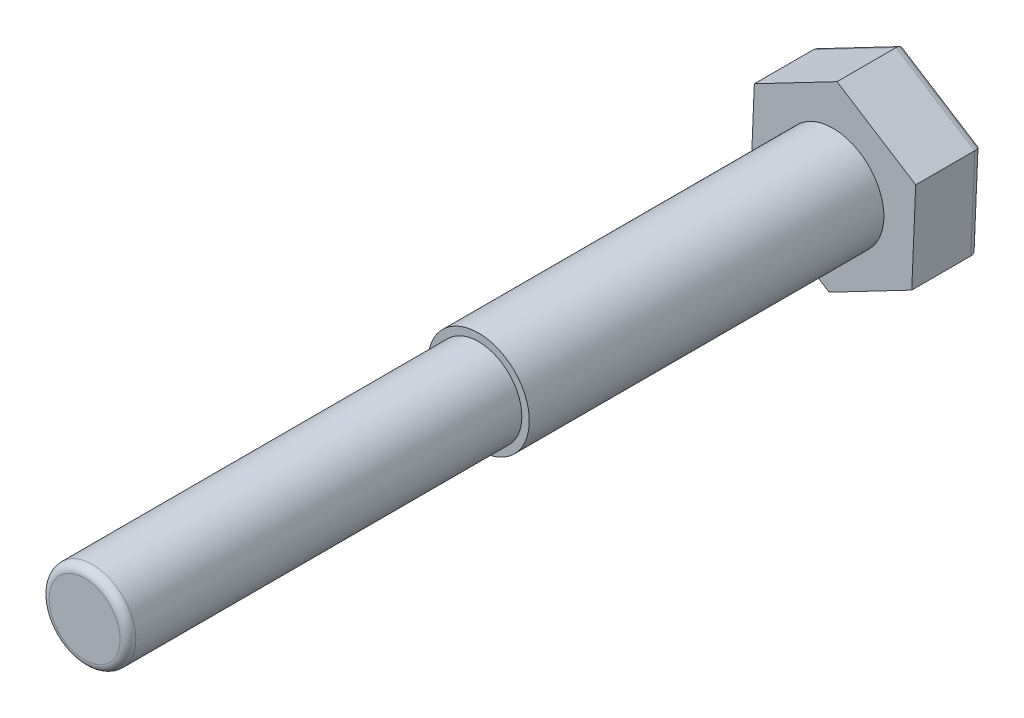
ISO-10303-21;
HEADER;
FILE_DESCRIPTION(('STEP AP214'),'2;1');
FILE_NAME('part.step','',(''),(''),'','','');
FILE_SCHEMA(('AUTOMOTIVE_DESIGN { 1 0 10303 214 1 1 1 1 }'));
ENDSEC;
DATA;
#1=APPLICATION_CONTEXT('core data for automotive mechanical design processes');
#2=APPLICATION_PROTOCOL_DEFINITION('international standard','automotive_design',2000,#1);
#3=PRODUCT_CONTEXT('',#1,'mechanical');
#4=PRODUCT('Part','Part','',(#3));
#5=PRODUCT_RELATED_PRODUCT_CATEGORY('part','',(#4));
#6=PRODUCT_DEFINITION_FORMATION('','',#4);
#7=PRODUCT_DEFINITION_CONTEXT('part definition',#1,'design');
#8=PRODUCT_DEFINITION('design','',#6,#7);
#9=PRODUCT_DEFINITION_SHAPE('','',#8);
#10=(LENGTH_UNIT() NAMED_UNIT(*) SI_UNIT(.MILLI.,.METRE.));
#11=(NAMED_UNIT(*) PLANE_ANGLE_UNIT() SI_UNIT($,.RADIAN.));
#12=(NAMED_UNIT(*) SI_UNIT($,.STERADIAN.) SOLID_ANGLE_UNIT());
#13=UNCERTAINTY_MEASURE_WITH_UNIT(LENGTH_MEASURE(1.E-05),#10,'distance_accuracy_value','');
#14=(GEOMETRIC_REPRESENTATION_CONTEXT(3) GLOBAL_UNCERTAINTY_ASSIGNED_CONTEXT((#13)) GLOBAL_UNIT_ASSIGNED_CONTEXT((#10,
#11,#12)) REPRESENTATION_CONTEXT('',''));
#15=CARTESIAN_POINT('',(0.,0.,0.));
#16=DIRECTION('',(0.,0.,1.));
#17=DIRECTION('',(1.,0.,0.));
#18=AXIS2_PLACEMENT_3D('',#15,#16,#17);
#19=CARTESIAN_POINT('',(0.,0.,107.));
#20=DIRECTION('',(0.,0.,1.));
#21=DIRECTION('',(1.,0.,0.));
#22=AXIS2_PLACEMENT_3D('',#19,#20,#21);
#23=PLANE('',#22);
#24=CARTESIAN_POINT('',(0.,0.,107.));
#25=DIRECTION('',(0.,0.,1.));
#26=DIRECTION('',(1.,0.,0.));
#27=AXIS2_PLACEMENT_3D('',#24,#25,#26);
#28=CIRCLE('',#27,12.9);
#29=CARTESIAN_POINT('',(-12.9,0.,107.));
#30=VERTEX_POINT('',#29);
#31=EDGE_CURVE('E130',#30,#30,#28,.T.);
#32=ORIENTED_EDGE('',*,*,#31,.T.);
#33=EDGE_LOOP('',(#32));
#34=FACE_BOUND('',#33,.T.);
#35=CARTESIAN_POINT('',(0.,0.,107.));
#36=DIRECTION('',(0.,0.,1.));
#37=DIRECTION('',(1.,0.,0.));
#38=AXIS2_PLACEMENT_3D('',#35,#36,#37);
#39=CIRCLE('',#38,11.);
#40=CARTESIAN_POINT('',(11.,0.,107.));
#41=VERTEX_POINT('',#40);
#42=EDGE_CURVE('E168',#41,#41,#39,.T.);
#43=ORIENTED_EDGE('',*,*,#42,.F.);
#44=EDGE_LOOP('',(#43));
#45=FACE_BOUND('',#44,.T.);
#46=ADVANCED_FACE('F36',(#34,#45),#23,.T.);
#47=CARTESIAN_POINT('',(18.9733976863162,-36.3457037383633,17.));
#48=DIRECTION('',(0.,0.,-1.));
#49=DIRECTION('',(-1.,0.,0.));
#50=AXIS2_PLACEMENT_3D('',#47,#48,#49);
#51=PLANE('',#50);
#52=DIRECTION('',(0.0424733530909036,0.999097599975706,0.));
#53=VECTOR('',#52,1.);
#54=CARTESIAN_POINT('',(19.9787997617734,-12.6957037383635,17.));
#55=LINE('',#54,#53);
#56=CARTESIAN_POINT('',(19.9787997617734,-12.6957037383635,17.));
#57=VERTEX_POINT('',#56);
#58=CARTESIAN_POINT('',(20.9842018372306,10.9542962616365,17.));
#59=VERTEX_POINT('',#58);
#60=EDGE_CURVE('E122',#57,#59,#55,.T.);
#61=ORIENTED_EDGE('',*,*,#60,.T.);
#62=DIRECTION('',(-0.844007225893572,0.536331802748482,0.));
#63=VECTOR('',#62,1.);
#64=CARTESIAN_POINT('',(20.9842018372306,10.9542962616365,17.));
#65=LINE('',#64,#63);
#66=CARTESIAN_POINT('',(1.0054020754572,23.65,17.));
#67=VERTEX_POINT('',#66);
#68=EDGE_CURVE('E110',#59,#67,#65,.T.);
#69=ORIENTED_EDGE('',*,*,#68,.T.);
#70=DIRECTION('',(-0.886480578984472,-0.462765797227231,0.));
#71=VECTOR('',#70,1.);
#72=CARTESIAN_POINT('',(1.0054020754572,23.65,17.));
#73=LINE('',#72,#71);
#74=CARTESIAN_POINT('',(-19.9787997617736,12.6957037383632,17.));
#75=VERTEX_POINT('',#74);
#76=EDGE_CURVE('E121',#67,#75,#73,.T.);
#77=ORIENTED_EDGE('',*,*,#76,.T.);
#78=DIRECTION('',(-0.0424733530908878,-0.999097599975706,0.));
#79=VECTOR('',#78,1.);
#80=CARTESIAN_POINT('',(-19.9787997617736,12.6957037383632,17.));
#81=LINE('',#80,#79);
#82=CARTESIAN_POINT('',(-20.9842018372304,-10.9542962616368,17.));
#83=VERTEX_POINT('',#82);
#84=EDGE_CURVE('E272',#75,#83,#81,.T.);
#85=ORIENTED_EDGE('',*,*,#84,.T.);
#86=DIRECTION('',(0.844007225893576,-0.536331802748476,0.));
#87=VECTOR('',#86,1.);
#88=CARTESIAN_POINT('',(-20.9842018372304,-10.9542962616368,17.));
#89=LINE('',#88,#87);
#90=CARTESIAN_POINT('',(-1.00540207545719,-23.65,17.));
#91=VERTEX_POINT('',#90);
#92=EDGE_CURVE('E274',#83,#91,#89,.T.);
#93=ORIENTED_EDGE('',*,*,#92,.T.);
#94=DIRECTION('',(0.886480578984476,0.462765797227224,0.));
#95=VECTOR('',#94,1.);
#96=CARTESIAN_POINT('',(-1.00540207545719,-23.65,17.));
#97=LINE('',#96,#95);
#98=EDGE_CURVE('E128',#91,#57,#97,.T.);
#99=ORIENTED_EDGE('',*,*,#98,.T.);
#100=EDGE_LOOP('',(#61,#69,#77,#85,#93,#99));
#101=FACE_BOUND('',#100,.T.);
#102=CARTESIAN_POINT('',(0.,0.,17.));
#103=DIRECTION('',(0.,0.,-1.));
#104=DIRECTION('',(-1.,0.,0.));
#105=AXIS2_PLACEMENT_3D('',#102,#103,#104);
#106=CIRCLE('',#105,12.9);
#107=CARTESIAN_POINT('',(-12.9,0.,17.));
#108=VERTEX_POINT('',#107);
#109=EDGE_CURVE('E135',#108,#108,#106,.F.);
#110=ORIENTED_EDGE('',*,*,#109,.F.);
#111=EDGE_LOOP('',(#110));
#112=FACE_BOUND('',#111,.T.);
#113=ADVANCED_FACE('F125',(#101,#112),#51,.F.);
#114=CARTESIAN_POINT('',(19.9787997617734,-12.6957037383635,17.));
#115=DIRECTION('',(-0.999097599975706,0.0424733530909036,0.));
#116=DIRECTION('',(-0.0424733530909036,-0.999097599975706,0.));
#117=AXIS2_PLACEMENT_3D('',#114,#115,#116);
#118=PLANE('',#117);
#119=DIRECTION('',(0.,0.,-1.));
#120=VECTOR('',#119,1.);
#121=CARTESIAN_POINT('',(19.9787997617734,-12.6957037383635,17.));
#122=LINE('',#121,#120);
#123=CARTESIAN_POINT('',(19.9787997617734,-12.6957037383635,2.));
#124=VERTEX_POINT('',#123);
#125=EDGE_CURVE('E279',#57,#124,#122,.T.);
#126=ORIENTED_EDGE('',*,*,#125,.T.);
#127=DIRECTION('',(0.0424733530909036,0.999097599975706,0.));
#128=VECTOR('',#127,1.);
#129=CARTESIAN_POINT('',(20.9842018372306,10.9542962616365,2.));
#130=LINE('',#129,#128);
#131=CARTESIAN_POINT('',(20.9842018372306,10.9542962616365,2.));
#132=VERTEX_POINT('',#131);
#133=EDGE_CURVE('E134',#124,#132,#130,.T.);
#134=ORIENTED_EDGE('',*,*,#133,.T.);
#135=DIRECTION('',(0.,0.,-1.));
#136=VECTOR('',#135,1.);
#137=CARTESIAN_POINT('',(20.9842018372306,10.9542962616365,17.));
#138=LINE('',#137,#136);
#139=EDGE_CURVE('E115',#59,#132,#138,.T.);
#140=ORIENTED_EDGE('',*,*,#139,.F.);
#141=ORIENTED_EDGE('',*,*,#60,.F.);
#142=EDGE_LOOP('',(#126,#134,#140,#141));
#143=FACE_BOUND('',#142,.T.);
#144=ADVANCED_FACE('F132',(#143),#118,.F.);
#145=CARTESIAN_POINT('',(20.9842018372306,10.9542962616365,17.));
#146=DIRECTION('',(-0.536331802748482,-0.844007225893572,0.));
#147=DIRECTION('',(0.844007225893572,-0.536331802748482,0.));
#148=AXIS2_PLACEMENT_3D('',#145,#146,#147);
#149=PLANE('',#148);
#150=ORIENTED_EDGE('',*,*,#139,.T.);
#151=DIRECTION('',(-0.844007225893572,0.536331802748482,0.));
#152=VECTOR('',#151,1.);
#153=CARTESIAN_POINT('',(1.00540207545719,23.65,2.));
#154=LINE('',#153,#152);
#155=CARTESIAN_POINT('',(1.0054020754572,23.65,2.));
#156=VERTEX_POINT('',#155);
#157=EDGE_CURVE('E138',#132,#156,#154,.T.);
#158=ORIENTED_EDGE('',*,*,#157,.T.);
#159=DIRECTION('',(0.,0.,-1.));
#160=VECTOR('',#159,1.);
#161=CARTESIAN_POINT('',(1.0054020754572,23.65,17.));
#162=LINE('',#161,#160);
#163=EDGE_CURVE('E118',#67,#156,#162,.T.);
#164=ORIENTED_EDGE('',*,*,#163,.F.);
#165=ORIENTED_EDGE('',*,*,#68,.F.);
#166=EDGE_LOOP('',(#150,#158,#164,#165));
#167=FACE_BOUND('',#166,.T.);
#168=ADVANCED_FACE('F112',(#167),#149,.F.);
#169=CARTESIAN_POINT('',(1.0054020754572,23.65,17.));
#170=DIRECTION('',(0.462765797227231,-0.886480578984472,0.));
#171=DIRECTION('',(0.886480578984472,0.462765797227231,0.));
#172=AXIS2_PLACEMENT_3D('',#169,#170,#171);
#173=PLANE('',#172);
#174=ORIENTED_EDGE('',*,*,#163,.T.);
#175=DIRECTION('',(-0.886480578984472,-0.462765797227231,0.));
#176=VECTOR('',#175,1.);
#177=CARTESIAN_POINT('',(-19.9787997617736,12.6957037383632,2.));
#178=LINE('',#177,#176);
#179=CARTESIAN_POINT('',(-19.9787997617736,12.6957037383632,2.));
#180=VERTEX_POINT('',#179);
#181=EDGE_CURVE('E158',#156,#180,#178,.T.);
#182=ORIENTED_EDGE('',*,*,#181,.T.);
#183=DIRECTION('',(0.,0.,-1.));
#184=VECTOR('',#183,1.);
#185=CARTESIAN_POINT('',(-19.9787997617736,12.6957037383632,17.));
#186=LINE('',#185,#184);
#187=EDGE_CURVE('E140',#75,#180,#186,.T.);
#188=ORIENTED_EDGE('',*,*,#187,.F.);
#189=ORIENTED_EDGE('',*,*,#76,.F.);
#190=EDGE_LOOP('',(#174,#182,#188,#189));
#191=FACE_BOUND('',#190,.T.);
#192=ADVANCED_FACE('F223',(#191),#173,.F.);
#193=CARTESIAN_POINT('',(-19.9787997617736,12.6957037383632,17.));
#194=DIRECTION('',(0.999097599975706,-0.0424733530908878,0.));
#195=DIRECTION('',(0.0424733530908878,0.999097599975707,0.));
#196=AXIS2_PLACEMENT_3D('',#193,#194,#195);
#197=PLANE('',#196);
#198=ORIENTED_EDGE('',*,*,#187,.T.);
#199=DIRECTION('',(-0.0424733530908878,-0.999097599975707,0.));
#200=VECTOR('',#199,1.);
#201=CARTESIAN_POINT('',(-20.9842018372304,-10.9542962616368,2.));
#202=LINE('',#201,#200);
#203=CARTESIAN_POINT('',(-20.9842018372304,-10.9542962616368,2.));
#204=VERTEX_POINT('',#203);
#205=EDGE_CURVE('E160',#180,#204,#202,.T.);
#206=ORIENTED_EDGE('',*,*,#205,.T.);
#207=DIRECTION('',(0.,0.,-1.));
#208=VECTOR('',#207,1.);
#209=CARTESIAN_POINT('',(-20.9842018372304,-10.9542962616368,17.));
#210=LINE('',#209,#208);
#211=EDGE_CURVE('E283',#83,#204,#210,.T.);
#212=ORIENTED_EDGE('',*,*,#211,.F.);
#213=ORIENTED_EDGE('',*,*,#84,.F.);
#214=EDGE_LOOP('',(#198,#206,#212,#213));
#215=FACE_BOUND('',#214,.T.);
#216=ADVANCED_FACE('F220',(#215),#197,.F.);
#217=CARTESIAN_POINT('',(-20.9842018372304,-10.9542962616368,17.));
#218=DIRECTION('',(0.536331802748476,0.844007225893576,0.));
#219=DIRECTION('',(-0.844007225893576,0.536331802748476,0.));
#220=AXIS2_PLACEMENT_3D('',#217,#218,#219);
#221=PLANE('',#220);
#222=ORIENTED_EDGE('',*,*,#211,.T.);
#223=DIRECTION('',(0.844007225893576,-0.536331802748476,0.));
#224=VECTOR('',#223,1.);
#225=CARTESIAN_POINT('',(-1.00540207545719,-23.65,2.));
#226=LINE('',#225,#224);
#227=CARTESIAN_POINT('',(-1.00540207545719,-23.65,2.));
#228=VERTEX_POINT('',#227);
#229=EDGE_CURVE('E59',#204,#228,#226,.T.);
#230=ORIENTED_EDGE('',*,*,#229,.T.);
#231=DIRECTION('',(0.,0.,-1.));
#232=VECTOR('',#231,1.);
#233=CARTESIAN_POINT('',(-1.00540207545719,-23.65,17.));
#234=LINE('',#233,#232);
#235=EDGE_CURVE('E281',#91,#228,#234,.T.);
#236=ORIENTED_EDGE('',*,*,#235,.F.);
#237=ORIENTED_EDGE('',*,*,#92,.F.);
#238=EDGE_LOOP('',(#222,#230,#236,#237));
#239=FACE_BOUND('',#238,.T.);
#240=ADVANCED_FACE('F217',(#239),#221,.F.);
#241=CARTESIAN_POINT('',(-1.00540207545719,-23.65,17.));
#242=DIRECTION('',(-0.462765797227224,0.886480578984476,0.));
#243=DIRECTION('',(-0.886480578984476,-0.462765797227224,0.));
#244=AXIS2_PLACEMENT_3D('',#241,#242,#243);
#245=PLANE('',#244);
#246=ORIENTED_EDGE('',*,*,#235,.T.);
#247=DIRECTION('',(0.886480578984476,0.462765797227224,0.));
#248=VECTOR('',#247,1.);
#249=CARTESIAN_POINT('',(19.9787997617734,-12.6957037383635,2.));
#250=LINE('',#249,#248);
#251=EDGE_CURVE('E51',#228,#124,#250,.T.);
#252=ORIENTED_EDGE('',*,*,#251,.T.);
#253=ORIENTED_EDGE('',*,*,#125,.F.);
#254=ORIENTED_EDGE('',*,*,#98,.F.);
#255=EDGE_LOOP('',(#246,#252,#253,#254));
#256=FACE_BOUND('',#255,.T.);
#257=ADVANCED_FACE('F213',(#256),#245,.F.);
#258=CARTESIAN_POINT('',(18.9733976863162,-36.3457037383633,0.));
#259=DIRECTION('',(0.,0.,-1.));
#260=DIRECTION('',(-1.,0.,0.));
#261=AXIS2_PLACEMENT_3D('',#258,#259,#260);
#262=PLANE('',#261);
#263=DIRECTION('',(-0.886480578984472,-0.462765797227231,0.));
#264=VECTOR('',#263,1.);
#265=CARTESIAN_POINT('',(1.93093366991166,21.8770388420311,0.));
#266=LINE('',#265,#264);
#267=CARTESIAN_POINT('',(-18.029648565503,11.4570984955961,0.));
#268=VERTEX_POINT('',#267);
#269=CARTESIAN_POINT('',(0.907314068095531,21.3426829268293,0.));
#270=VERTEX_POINT('',#269);
#271=EDGE_CURVE('E153',#268,#270,#266,.F.);
#272=ORIENTED_EDGE('',*,*,#271,.T.);
#273=DIRECTION('',(-0.844007225893572,0.536331802748482,0.));
#274=VECTOR('',#273,1.);
#275=CARTESIAN_POINT('',(19.9115382317336,9.26628180984933,0.));
#276=LINE('',#275,#274);
#277=CARTESIAN_POINT('',(18.9369626335983,9.88558443123292,0.));
#278=VERTEX_POINT('',#277);
#279=EDGE_CURVE('E155',#270,#278,#276,.F.);
#280=ORIENTED_EDGE('',*,*,#279,.T.);
#281=DIRECTION('',(0.0424733530909036,0.999097599975706,0.));
#282=VECTOR('',#281,1.);
#283=CARTESIAN_POINT('',(17.980604561822,-12.6107570321817,0.));
#284=LINE('',#283,#282);
#285=CARTESIAN_POINT('',(18.0296485655028,-11.4570984955964,0.));
#286=VERTEX_POINT('',#285);
#287=EDGE_CURVE('E145',#278,#286,#284,.F.);
#288=ORIENTED_EDGE('',*,*,#287,.T.);
#289=DIRECTION('',(0.886480578984476,0.462765797227224,0.));
#290=VECTOR('',#289,1.);
#291=CARTESIAN_POINT('',(-1.93093366991164,-21.877038842031,0.));
#292=LINE('',#291,#290);
#293=CARTESIAN_POINT('',(-0.90731406809552,-21.3426829268293,0.));
#294=VERTEX_POINT('',#293);
#295=EDGE_CURVE('E147',#286,#294,#292,.F.);
#296=ORIENTED_EDGE('',*,*,#295,.T.);
#297=DIRECTION('',(0.844007225893576,-0.536331802748476,0.));
#298=VECTOR('',#297,1.);
#299=CARTESIAN_POINT('',(-19.9115382317334,-9.26628180984964,0.));
#300=LINE('',#299,#298);
#301=CARTESIAN_POINT('',(-18.9369626335981,-9.88558443123322,0.));
#302=VERTEX_POINT('',#301);
#303=EDGE_CURVE('E149',#294,#302,#300,.F.);
#304=ORIENTED_EDGE('',*,*,#303,.T.);
#305=DIRECTION('',(-0.0424733530908878,-0.999097599975707,0.));
#306=VECTOR('',#305,1.);
#307=CARTESIAN_POINT('',(-17.9806045618221,12.6107570321814,0.));
#308=LINE('',#307,#306);
#309=EDGE_CURVE('E151',#302,#268,#308,.F.);
#310=ORIENTED_EDGE('',*,*,#309,.T.);
#311=EDGE_LOOP('',(#272,#280,#288,#296,#304,#310));
#312=FACE_BOUND('',#311,.T.);
#313=ADVANCED_FACE('F208',(#312),#262,.T.);
#314=CARTESIAN_POINT('',(0.,0.,107.));
#315=DIRECTION('',(0.,0.,-1.));
#316=DIRECTION('',(-1.,0.,0.));
#317=AXIS2_PLACEMENT_3D('',#314,#315,#316);
#318=CYLINDRICAL_SURFACE('',#317,12.9);
#319=CARTESIAN_POINT('',(-12.9,0.,107.));
#320=CARTESIAN_POINT('',(-12.9,0.,106.0625));
#321=CARTESIAN_POINT('',(-12.9,0.,105.125));
#322=CARTESIAN_POINT('',(-12.9,0.,103.25));
#323=CARTESIAN_POINT('',(-12.9,0.,102.3125));
#324=CARTESIAN_POINT('',(-12.9,0.,100.4375));
#325=CARTESIAN_POINT('',(-12.9,0.,99.5));
#326=CARTESIAN_POINT('',(-12.9,0.,97.625));
#327=CARTESIAN_POINT('',(-12.9,0.,96.6875));
#328=CARTESIAN_POINT('',(-12.9,0.,94.8125));
#329=CARTESIAN_POINT('',(-12.9,0.,93.875));
#330=CARTESIAN_POINT('',(-12.9,0.,92.));
#331=CARTESIAN_POINT('',(-12.9,0.,91.0625));
#332=CARTESIAN_POINT('',(-12.9,0.,89.1875));
#333=CARTESIAN_POINT('',(-12.9,0.,88.25));
#334=CARTESIAN_POINT('',(-12.9,0.,86.375));
#335=CARTESIAN_POINT('',(-12.9,0.,85.4375));
#336=CARTESIAN_POINT('',(-12.9,0.,83.5625));
#337=CARTESIAN_POINT('',(-12.9,0.,82.625));
#338=CARTESIAN_POINT('',(-12.9,0.,80.75));
#339=CARTESIAN_POINT('',(-12.9,0.,79.8125));
#340=CARTESIAN_POINT('',(-12.9,0.,77.9375));
#341=CARTESIAN_POINT('',(-12.9,0.,77.));
#342=CARTESIAN_POINT('',(-12.9,0.,75.125));
#343=CARTESIAN_POINT('',(-12.9,0.,74.1875));
#344=CARTESIAN_POINT('',(-12.9,0.,72.3125));
#345=CARTESIAN_POINT('',(-12.9,0.,71.375));
#346=CARTESIAN_POINT('',(-12.9,0.,69.5));
#347=CARTESIAN_POINT('',(-12.9,0.,68.5625));
#348=CARTESIAN_POINT('',(-12.9,0.,66.6875));
#349=CARTESIAN_POINT('',(-12.9,0.,65.75));
#350=CARTESIAN_POINT('',(-12.9,0.,63.875));
#351=CARTESIAN_POINT('',(-12.9,0.,62.9375));
#352=CARTESIAN_POINT('',(-12.9,0.,61.0625));
#353=CARTESIAN_POINT('',(-12.9,0.,60.125));
#354=CARTESIAN_POINT('',(-12.9,0.,58.25));
#355=CARTESIAN_POINT('',(-12.9,0.,57.3125));
#356=CARTESIAN_POINT('',(-12.9,0.,55.4375));
#357=CARTESIAN_POINT('',(-12.9,0.,54.5));
#358=CARTESIAN_POINT('',(-12.9,0.,52.625));
#359=CARTESIAN_POINT('',(-12.9,0.,51.6875));
#360=CARTESIAN_POINT('',(-12.9,0.,49.8125));
#361=CARTESIAN_POINT('',(-12.9,0.,48.875));
#362=CARTESIAN_POINT('',(-12.9,0.,47.));
#363=CARTESIAN_POINT('',(-12.9,0.,46.0625));
#364=CARTESIAN_POINT('',(-12.9,0.,44.1875));
#365=CARTESIAN_POINT('',(-12.9,0.,43.25));
#366=CARTESIAN_POINT('',(-12.9,0.,41.375));
#367=CARTESIAN_POINT('',(-12.9,0.,40.4375));
#368=CARTESIAN_POINT('',(-12.9,0.,38.5625));
#369=CARTESIAN_POINT('',(-12.9,0.,37.625));
#370=CARTESIAN_POINT('',(-12.9,0.,35.75));
#371=CARTESIAN_POINT('',(-12.9,0.,34.8125));
#372=CARTESIAN_POINT('',(-12.9,0.,32.9375));
#373=CARTESIAN_POINT('',(-12.9,0.,32.));
#374=CARTESIAN_POINT('',(-12.9,0.,30.125));
#375=CARTESIAN_POINT('',(-12.9,0.,29.1875));
#376=CARTESIAN_POINT('',(-12.9,0.,27.3125));
#377=CARTESIAN_POINT('',(-12.9,0.,26.375));
#378=CARTESIAN_POINT('',(-12.9,0.,24.5));
#379=CARTESIAN_POINT('',(-12.9,0.,23.5625));
#380=CARTESIAN_POINT('',(-12.9,0.,21.6875));
#381=CARTESIAN_POINT('',(-12.9,0.,20.75));
#382=CARTESIAN_POINT('',(-12.9,0.,18.875));
#383=CARTESIAN_POINT('',(-12.9,0.,17.9375));
#384=CARTESIAN_POINT('',(-12.9,0.,17.));
#385=B_SPLINE_CURVE_WITH_KNOTS('',3,(#319,#320,#321,#322,#323,#324,#325,#326,#327,#328,#329,
#330,#331,#332,#333,#334,#335,#336,#337,#338,#339,#340,#341,#342,#343,#344,#345,#346,#347,#348,
#349,#350,#351,#352,#353,#354,#355,#356,#357,#358,#359,#360,#361,#362,#363,#364,#365,#366,#367,
#368,#369,#370,#371,#372,#373,#374,#375,#376,#377,#378,#379,#380,#381,#382,#383,#384),
.UNSPECIFIED.,.F.,.F.,(4,2,2,2,2,2,2,2,2,2,2,2,2,2,2,2,2,2,2,2,2,2,2,2,2,2,2,2,2,2,2,2,4),(0.,
2.81250000000001,5.62500000000001,8.4375,11.25,14.0625,16.875,19.6875,22.5,25.3125,28.125,
30.9375,33.75,36.5625,39.375,42.1875,45.,47.8125,50.625,53.4375,56.25,59.0625,61.875,64.6875,
67.5,70.3125,73.125,75.9375,78.75,81.5625,84.375,87.1875,90.),.UNSPECIFIED.);
#386=EDGE_CURVE('BSEAM205',#30,#108,#385,.T.);
#387=ORIENTED_EDGE('',*,*,#31,.F.);
#388=ORIENTED_EDGE('',*,*,#109,.T.);
#389=ORIENTED_EDGE('',*,*,#386,.T.);
#390=ORIENTED_EDGE('',*,*,#386,.F.);
#391=EDGE_LOOP('',(#387,#389,#388,#390));
#392=FACE_BOUND('',#391,.T.);
#393=ADVANCED_FACE('F205',(#392),#318,.T.);
#394=CARTESIAN_POINT('',(-19.9115382317334,-9.26628180984964,2.));
#395=DIRECTION('',(-0.844007225893576,0.536331802748476,0.));
#396=DIRECTION('',(-0.536331802748476,-0.844007225893576,0.));
#397=AXIS2_PLACEMENT_3D('',#394,#395,#396);
#398=CYLINDRICAL_SURFACE('',#397,2.);
#399=CARTESIAN_POINT('',(-18.9369626335981,-9.88558443123322,2.));
#400=DIRECTION('',(-0.462765797227234,0.886480578984471,0.));
#401=DIRECTION('',(-0.886480578984471,-0.462765797227234,0.));
#402=AXIS2_PLACEMENT_3D('',#399,#400,#401);
#403=ELLIPSE('',#402,2.3094010767585,2.);
#404=EDGE_CURVE('E176',#302,#204,#403,.T.);
#405=ORIENTED_EDGE('',*,*,#404,.F.);
#406=ORIENTED_EDGE('',*,*,#303,.F.);
#407=CARTESIAN_POINT('',(-0.90731406809552,-21.3426829268293,2.));
#408=DIRECTION('',(-0.999097599975706,0.0424733530909003,0.));
#409=DIRECTION('',(-0.0424733530909002,-0.999097599975706,0.));
#410=AXIS2_PLACEMENT_3D('',#407,#408,#409);
#411=ELLIPSE('',#410,2.3094010767585,2.);
#412=EDGE_CURVE('E179',#228,#294,#411,.F.);
#413=ORIENTED_EDGE('',*,*,#412,.F.);
#414=ORIENTED_EDGE('',*,*,#229,.F.);
#415=EDGE_LOOP('',(#405,#406,#413,#414));
#416=FACE_BOUND('',#415,.T.);
#417=ADVANCED_FACE('F207',(#416),#398,.T.);
#418=CARTESIAN_POINT('',(-1.93093366991164,-21.877038842031,2.));
#419=DIRECTION('',(-0.886480578984476,-0.462765797227224,0.));
#420=DIRECTION('',(0.462765797227224,-0.886480578984476,0.));
#421=AXIS2_PLACEMENT_3D('',#418,#419,#420);
#422=CYLINDRICAL_SURFACE('',#421,2.);
#423=ORIENTED_EDGE('',*,*,#412,.T.);
#424=ORIENTED_EDGE('',*,*,#295,.F.);
#425=CARTESIAN_POINT('',(18.0296485655028,-11.4570984955964,2.));
#426=DIRECTION('',(-0.536331802748482,-0.844007225893572,0.));
#427=DIRECTION('',(0.844007225893572,-0.536331802748482,0.));
#428=AXIS2_PLACEMENT_3D('',#425,#426,#427);
#429=ELLIPSE('',#428,2.3094010767585,2.);
#430=EDGE_CURVE('E173',#124,#286,#429,.F.);
#431=ORIENTED_EDGE('',*,*,#430,.F.);
#432=ORIENTED_EDGE('',*,*,#251,.F.);
#433=EDGE_LOOP('',(#423,#424,#431,#432));
#434=FACE_BOUND('',#433,.T.);
#435=ADVANCED_FACE('F247',(#434),#422,.T.);
#436=CARTESIAN_POINT('',(-17.9806045618221,12.6107570321814,2.));
#437=DIRECTION('',(0.0424733530908878,0.999097599975707,0.));
#438=DIRECTION('',(-0.999097599975707,0.0424733530908878,0.));
#439=AXIS2_PLACEMENT_3D('',#436,#437,#438);
#440=CYLINDRICAL_SURFACE('',#439,2.);
#441=ORIENTED_EDGE('',*,*,#404,.T.);
#442=ORIENTED_EDGE('',*,*,#205,.F.);
#443=CARTESIAN_POINT('',(-18.029648565503,11.457098495596,2.));
#444=DIRECTION('',(0.536331802748472,0.844007225893579,0.));
#445=DIRECTION('',(-0.844007225893579,0.536331802748472,0.));
#446=AXIS2_PLACEMENT_3D('',#443,#444,#445);
#447=ELLIPSE('',#446,2.30940107675851,2.);
#448=EDGE_CURVE('E170',#268,#180,#447,.T.);
#449=ORIENTED_EDGE('',*,*,#448,.F.);
#450=ORIENTED_EDGE('',*,*,#309,.F.);
#451=EDGE_LOOP('',(#441,#442,#449,#450));
#452=FACE_BOUND('',#451,.T.);
#453=ADVANCED_FACE('F243',(#452),#440,.T.);
#454=CARTESIAN_POINT('',(17.980604561822,-12.6107570321817,2.));
#455=DIRECTION('',(-0.0424733530909036,-0.999097599975706,0.));
#456=DIRECTION('',(0.999097599975706,-0.0424733530909036,0.));
#457=AXIS2_PLACEMENT_3D('',#454,#455,#456);
#458=CYLINDRICAL_SURFACE('',#457,2.);
#459=ORIENTED_EDGE('',*,*,#430,.T.);
#460=ORIENTED_EDGE('',*,*,#287,.F.);
#461=CARTESIAN_POINT('',(18.9369626335983,9.88558443123291,2.));
#462=DIRECTION('',(0.462765797227224,-0.886480578984476,0.));
#463=DIRECTION('',(-0.886480578984476,-0.462765797227224,0.));
#464=AXIS2_PLACEMENT_3D('',#461,#462,#463);
#465=ELLIPSE('',#464,2.3094010767585,2.);
#466=EDGE_CURVE('E167',#132,#278,#465,.F.);
#467=ORIENTED_EDGE('',*,*,#466,.F.);
#468=ORIENTED_EDGE('',*,*,#133,.F.);
#469=EDGE_LOOP('',(#459,#460,#467,#468));
#470=FACE_BOUND('',#469,.T.);
#471=ADVANCED_FACE('F239',(#470),#458,.T.);
#472=CARTESIAN_POINT('',(1.93093366991166,21.8770388420311,2.));
#473=DIRECTION('',(0.886480578984472,0.462765797227231,0.));
#474=DIRECTION('',(-0.462765797227231,0.886480578984472,0.));
#475=AXIS2_PLACEMENT_3D('',#472,#473,#474);
#476=CYLINDRICAL_SURFACE('',#475,2.);
#477=ORIENTED_EDGE('',*,*,#448,.T.);
#478=ORIENTED_EDGE('',*,*,#181,.F.);
#479=CARTESIAN_POINT('',(0.907314068095525,21.3426829268293,2.));
#480=DIRECTION('',(0.999097599975706,-0.0424733530908997,0.));
#481=DIRECTION('',(0.0424733530908995,0.999097599975706,0.));
#482=AXIS2_PLACEMENT_3D('',#479,#480,#481);
#483=ELLIPSE('',#482,2.30940107675851,2.);
#484=EDGE_CURVE('E165',#270,#156,#483,.T.);
#485=ORIENTED_EDGE('',*,*,#484,.F.);
#486=ORIENTED_EDGE('',*,*,#271,.F.);
#487=EDGE_LOOP('',(#477,#478,#485,#486));
#488=FACE_BOUND('',#487,.T.);
#489=ADVANCED_FACE('F235',(#488),#476,.T.);
#490=CARTESIAN_POINT('',(19.9115382317336,9.26628180984933,2.));
#491=DIRECTION('',(0.844007225893572,-0.536331802748482,0.));
#492=DIRECTION('',(0.536331802748482,0.844007225893572,0.));
#493=AXIS2_PLACEMENT_3D('',#490,#491,#492);
#494=CYLINDRICAL_SURFACE('',#493,2.);
#495=ORIENTED_EDGE('',*,*,#466,.T.);
#496=ORIENTED_EDGE('',*,*,#279,.F.);
#497=ORIENTED_EDGE('',*,*,#484,.T.);
#498=ORIENTED_EDGE('',*,*,#157,.F.);
#499=EDGE_LOOP('',(#495,#496,#497,#498));
#500=FACE_BOUND('',#499,.T.);
#501=ADVANCED_FACE('F232',(#500),#494,.T.);
#502=CARTESIAN_POINT('',(0.,0.,207.));
#503=DIRECTION('',(0.,0.,-1.));
#504=DIRECTION('',(-1.,0.,0.));
#505=AXIS2_PLACEMENT_3D('',#502,#503,#504);
#506=CYLINDRICAL_SURFACE('',#505,11.);
#507=CARTESIAN_POINT('',(0.,0.,205.));
#508=DIRECTION('',(0.,0.,1.));
#509=DIRECTION('',(1.,0.,0.));
#510=AXIS2_PLACEMENT_3D('',#507,#508,#509);
#511=CIRCLE('',#510,11.);
#512=CARTESIAN_POINT('',(11.,0.,205.));
#513=VERTEX_POINT('',#512);
#514=EDGE_CURVE('E11',#513,#513,#511,.F.);
#515=ORIENTED_EDGE('',*,*,#514,.T.);
#516=EDGE_LOOP('',(#515));
#517=FACE_BOUND('',#516,.T.);
#518=ORIENTED_EDGE('',*,*,#42,.T.);
#519=EDGE_LOOP('',(#518));
#520=FACE_BOUND('',#519,.T.);
#521=ADVANCED_FACE('F191',(#517,#520),#506,.T.);
#522=CARTESIAN_POINT('',(0.,0.,207.));
#523=DIRECTION('',(0.,0.,1.));
#524=DIRECTION('',(1.,0.,0.));
#525=AXIS2_PLACEMENT_3D('',#522,#523,#524);
#526=PLANE('',#525);
#527=CARTESIAN_POINT('',(0.,0.,207.));
#528=DIRECTION('',(0.,0.,1.));
#529=DIRECTION('',(1.,0.,0.));
#530=AXIS2_PLACEMENT_3D('',#527,#528,#529);
#531=CIRCLE('',#530,9.);
#532=CARTESIAN_POINT('',(9.,0.,207.));
#533=VERTEX_POINT('',#532);
#534=EDGE_CURVE('E44',#533,#533,#531,.T.);
#535=ORIENTED_EDGE('',*,*,#534,.T.);
#536=EDGE_LOOP('',(#535));
#537=FACE_BOUND('',#536,.T.);
#538=ADVANCED_FACE('F184',(#537),#526,.T.);
#539=CARTESIAN_POINT('',(0.,0.,205.));
#540=DIRECTION('',(0.,0.,1.));
#541=DIRECTION('',(1.,0.,0.));
#542=AXIS2_PLACEMENT_3D('',#539,#540,#541);
#543=TOROIDAL_SURFACE('',#542,9.,2.);
#544=ORIENTED_EDGE('',*,*,#514,.F.);
#545=EDGE_LOOP('',(#544));
#546=FACE_BOUND('',#545,.T.);
#547=ORIENTED_EDGE('',*,*,#534,.F.);
#548=EDGE_LOOP('',(#547));
#549=FACE_BOUND('',#548,.T.);
#550=ADVANCED_FACE('F38',(#546,#549),#543,.T.);
#551=CLOSED_SHELL('',(#46,#113,#144,#168,#192,#216,#240,#257,#313,#393,#417,#435,#453,#471,#489,
#501,#521,#538,#550));
#552=MANIFOLD_SOLID_BREP('B2',#551);
#553=ADVANCED_BREP_SHAPE_REPRESENTATION('',(#18,#552),#14);
#554=SHAPE_DEFINITION_REPRESENTATION(#9,#553);
ENDSEC;
END-ISO-10303-21;
